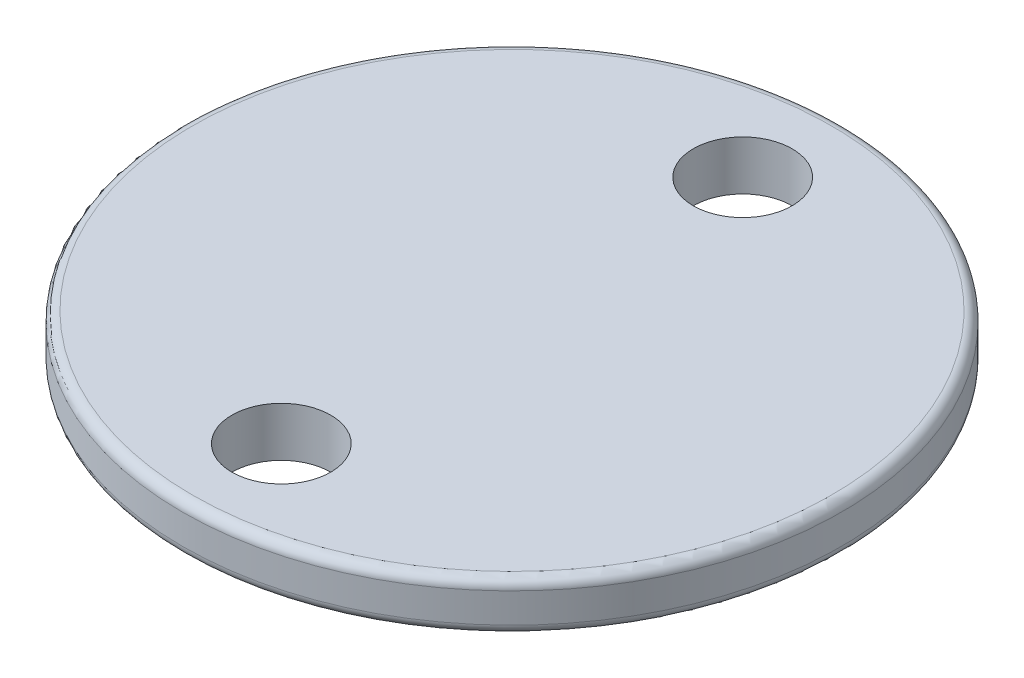
ISO-10303-21;
HEADER;
FILE_DESCRIPTION(('STEP AP214'),'2;1');
FILE_NAME('part.step','',(''),(''),'','','');
FILE_SCHEMA(('AUTOMOTIVE_DESIGN { 1 0 10303 214 1 1 1 1 }'));
ENDSEC;
DATA;
#1=APPLICATION_CONTEXT('core data for automotive mechanical design processes');
#2=APPLICATION_PROTOCOL_DEFINITION('international standard','automotive_design',2000,#1);
#3=PRODUCT_CONTEXT('',#1,'mechanical');
#4=PRODUCT('Part','Part','',(#3));
#5=PRODUCT_RELATED_PRODUCT_CATEGORY('part','',(#4));
#6=PRODUCT_DEFINITION_FORMATION('','',#4);
#7=PRODUCT_DEFINITION_CONTEXT('part definition',#1,'design');
#8=PRODUCT_DEFINITION('design','',#6,#7);
#9=PRODUCT_DEFINITION_SHAPE('','',#8);
#10=(LENGTH_UNIT() NAMED_UNIT(*) SI_UNIT(.MILLI.,.METRE.));
#11=(NAMED_UNIT(*) PLANE_ANGLE_UNIT() SI_UNIT($,.RADIAN.));
#12=(NAMED_UNIT(*) SI_UNIT($,.STERADIAN.) SOLID_ANGLE_UNIT());
#13=UNCERTAINTY_MEASURE_WITH_UNIT(LENGTH_MEASURE(1.E-05),#10,'distance_accuracy_value','');
#14=(GEOMETRIC_REPRESENTATION_CONTEXT(3) GLOBAL_UNCERTAINTY_ASSIGNED_CONTEXT((#13)) GLOBAL_UNIT_ASSIGNED_CONTEXT((#10,
#11,#12)) REPRESENTATION_CONTEXT('',''));
#15=CARTESIAN_POINT('',(0.,0.,0.));
#16=DIRECTION('',(0.,0.,1.));
#17=DIRECTION('',(1.,0.,0.));
#18=AXIS2_PLACEMENT_3D('',#15,#16,#17);
#19=CARTESIAN_POINT('',(0.,1.5,0.));
#20=DIRECTION('',(0.,1.,0.));
#21=DIRECTION('',(0.,0.,1.));
#22=AXIS2_PLACEMENT_3D('',#19,#20,#21);
#23=PLANE('',#22);
#24=CARTESIAN_POINT('',(0.,1.5,0.));
#25=DIRECTION('',(0.,1.,0.));
#26=DIRECTION('',(0.,0.,1.));
#27=AXIS2_PLACEMENT_3D('',#24,#25,#26);
#28=CIRCLE('',#27,9.7);
#29=CARTESIAN_POINT('',(0.,1.5,9.7));
#30=VERTEX_POINT('',#29);
#31=EDGE_CURVE('E10',#30,#30,#28,.T.);
#32=ORIENTED_EDGE('',*,*,#31,.T.);
#33=EDGE_LOOP('',(#32));
#34=FACE_BOUND('',#33,.T.);
#35=CARTESIAN_POINT('',(0.,1.5,-7.));
#36=DIRECTION('',(0.,1.,0.));
#37=DIRECTION('',(0.,0.,1.));
#38=AXIS2_PLACEMENT_3D('',#35,#36,#37);
#39=CIRCLE('',#38,1.5);
#40=CARTESIAN_POINT('',(0.,1.5,-5.5));
#41=VERTEX_POINT('',#40);
#42=EDGE_CURVE('E51',#41,#41,#39,.T.);
#43=ORIENTED_EDGE('',*,*,#42,.F.);
#44=EDGE_LOOP('',(#43));
#45=FACE_BOUND('',#44,.T.);
#46=CARTESIAN_POINT('',(0.,1.5,7.));
#47=DIRECTION('',(0.,1.,0.));
#48=DIRECTION('',(0.,0.,1.));
#49=AXIS2_PLACEMENT_3D('',#46,#47,#48);
#50=CIRCLE('',#49,1.5);
#51=CARTESIAN_POINT('',(0.,1.5,8.5));
#52=VERTEX_POINT('',#51);
#53=EDGE_CURVE('E55',#52,#52,#50,.T.);
#54=ORIENTED_EDGE('',*,*,#53,.F.);
#55=EDGE_LOOP('',(#54));
#56=FACE_BOUND('',#55,.T.);
#57=ADVANCED_FACE('F31',(#34,#45,#56),#23,.T.);
#58=CARTESIAN_POINT('',(0.,0.,0.));
#59=DIRECTION('',(0.,1.,0.));
#60=DIRECTION('',(0.,0.,1.));
#61=AXIS2_PLACEMENT_3D('',#58,#59,#60);
#62=PLANE('',#61);
#63=CARTESIAN_POINT('',(0.,0.,0.));
#64=DIRECTION('',(0.,1.,0.));
#65=DIRECTION('',(0.,0.,1.));
#66=AXIS2_PLACEMENT_3D('',#63,#64,#65);
#67=CIRCLE('',#66,9.7);
#68=CARTESIAN_POINT('',(0.,0.,9.7));
#69=VERTEX_POINT('',#68);
#70=EDGE_CURVE('E38',#69,#69,#67,.F.);
#71=ORIENTED_EDGE('',*,*,#70,.T.);
#72=EDGE_LOOP('',(#71));
#73=FACE_BOUND('',#72,.T.);
#74=CARTESIAN_POINT('',(0.,0.,-7.));
#75=DIRECTION('',(0.,1.,0.));
#76=DIRECTION('',(0.,0.,1.));
#77=AXIS2_PLACEMENT_3D('',#74,#75,#76);
#78=CIRCLE('',#77,1.5);
#79=CARTESIAN_POINT('',(0.,0.,-5.5));
#80=VERTEX_POINT('',#79);
#81=EDGE_CURVE('E52',#80,#80,#78,.T.);
#82=ORIENTED_EDGE('',*,*,#81,.T.);
#83=EDGE_LOOP('',(#82));
#84=FACE_BOUND('',#83,.T.);
#85=CARTESIAN_POINT('',(0.,0.,7.));
#86=DIRECTION('',(0.,1.,0.));
#87=DIRECTION('',(0.,0.,1.));
#88=AXIS2_PLACEMENT_3D('',#85,#86,#87);
#89=CIRCLE('',#88,1.5);
#90=CARTESIAN_POINT('',(0.,0.,8.5));
#91=VERTEX_POINT('',#90);
#92=EDGE_CURVE('E58',#91,#91,#89,.T.);
#93=ORIENTED_EDGE('',*,*,#92,.T.);
#94=EDGE_LOOP('',(#93));
#95=FACE_BOUND('',#94,.T.);
#96=ADVANCED_FACE('F68',(#73,#84,#95),#62,.F.);
#97=CARTESIAN_POINT('',(0.,1.5,0.));
#98=DIRECTION('',(0.,-1.,0.));
#99=DIRECTION('',(0.,0.,-1.));
#100=AXIS2_PLACEMENT_3D('',#97,#98,#99);
#101=CYLINDRICAL_SURFACE('',#100,10.);
#102=CARTESIAN_POINT('',(0.,0.3,0.));
#103=DIRECTION('',(0.,1.,0.));
#104=DIRECTION('',(0.,0.,1.));
#105=AXIS2_PLACEMENT_3D('',#102,#103,#104);
#106=CIRCLE('',#105,10.);
#107=CARTESIAN_POINT('',(0.,0.3,10.));
#108=VERTEX_POINT('',#107);
#109=EDGE_CURVE('E42',#108,#108,#106,.T.);
#110=ORIENTED_EDGE('',*,*,#109,.T.);
#111=EDGE_LOOP('',(#110));
#112=FACE_BOUND('',#111,.T.);
#113=CARTESIAN_POINT('',(0.,1.2,0.));
#114=DIRECTION('',(0.,1.,0.));
#115=DIRECTION('',(0.,0.,1.));
#116=AXIS2_PLACEMENT_3D('',#113,#114,#115);
#117=CIRCLE('',#116,10.);
#118=CARTESIAN_POINT('',(0.,1.2,10.));
#119=VERTEX_POINT('',#118);
#120=EDGE_CURVE('E46',#119,#119,#117,.F.);
#121=ORIENTED_EDGE('',*,*,#120,.T.);
#122=EDGE_LOOP('',(#121));
#123=FACE_BOUND('',#122,.T.);
#124=ADVANCED_FACE('F73',(#112,#123),#101,.T.);
#125=CARTESIAN_POINT('',(0.,1.5,-7.));
#126=DIRECTION('',(0.,-1.,0.));
#127=DIRECTION('',(0.,0.,-1.));
#128=AXIS2_PLACEMENT_3D('',#125,#126,#127);
#129=CYLINDRICAL_SURFACE('',#128,1.5);
#130=ORIENTED_EDGE('',*,*,#42,.T.);
#131=EDGE_LOOP('',(#130));
#132=FACE_BOUND('',#131,.T.);
#133=ORIENTED_EDGE('',*,*,#81,.F.);
#134=EDGE_LOOP('',(#133));
#135=FACE_BOUND('',#134,.T.);
#136=ADVANCED_FACE('F77',(#132,#135),#129,.F.);
#137=CARTESIAN_POINT('',(0.,1.5,7.));
#138=DIRECTION('',(0.,-1.,0.));
#139=DIRECTION('',(0.,0.,-1.));
#140=AXIS2_PLACEMENT_3D('',#137,#138,#139);
#141=CYLINDRICAL_SURFACE('',#140,1.5);
#142=ORIENTED_EDGE('',*,*,#53,.T.);
#143=EDGE_LOOP('',(#142));
#144=FACE_BOUND('',#143,.T.);
#145=ORIENTED_EDGE('',*,*,#92,.F.);
#146=EDGE_LOOP('',(#145));
#147=FACE_BOUND('',#146,.T.);
#148=ADVANCED_FACE('F64',(#144,#147),#141,.F.);
#149=CARTESIAN_POINT('',(0.,0.3,0.));
#150=DIRECTION('',(0.,1.,0.));
#151=DIRECTION('',(0.,0.,1.));
#152=AXIS2_PLACEMENT_3D('',#149,#150,#151);
#153=TOROIDAL_SURFACE('',#152,9.7,0.3);
#154=ORIENTED_EDGE('',*,*,#70,.F.);
#155=EDGE_LOOP('',(#154));
#156=FACE_BOUND('',#155,.T.);
#157=ORIENTED_EDGE('',*,*,#109,.F.);
#158=EDGE_LOOP('',(#157));
#159=FACE_BOUND('',#158,.T.);
#160=ADVANCED_FACE('F82',(#156,#159),#153,.T.);
#161=CARTESIAN_POINT('',(0.,1.2,0.));
#162=DIRECTION('',(0.,1.,0.));
#163=DIRECTION('',(0.,0.,1.));
#164=AXIS2_PLACEMENT_3D('',#161,#162,#163);
#165=TOROIDAL_SURFACE('',#164,9.7,0.3);
#166=ORIENTED_EDGE('',*,*,#120,.F.);
#167=EDGE_LOOP('',(#166));
#168=FACE_BOUND('',#167,.T.);
#169=ORIENTED_EDGE('',*,*,#31,.F.);
#170=EDGE_LOOP('',(#169));
#171=FACE_BOUND('',#170,.T.);
#172=ADVANCED_FACE('F33',(#168,#171),#165,.T.);
#173=CLOSED_SHELL('',(#57,#96,#124,#136,#148,#160,#172));
#174=MANIFOLD_SOLID_BREP('B2',#173);
#175=ADVANCED_BREP_SHAPE_REPRESENTATION('',(#18,#174),#14);
#176=SHAPE_DEFINITION_REPRESENTATION(#9,#175);
ENDSEC;
END-ISO-10303-21;
